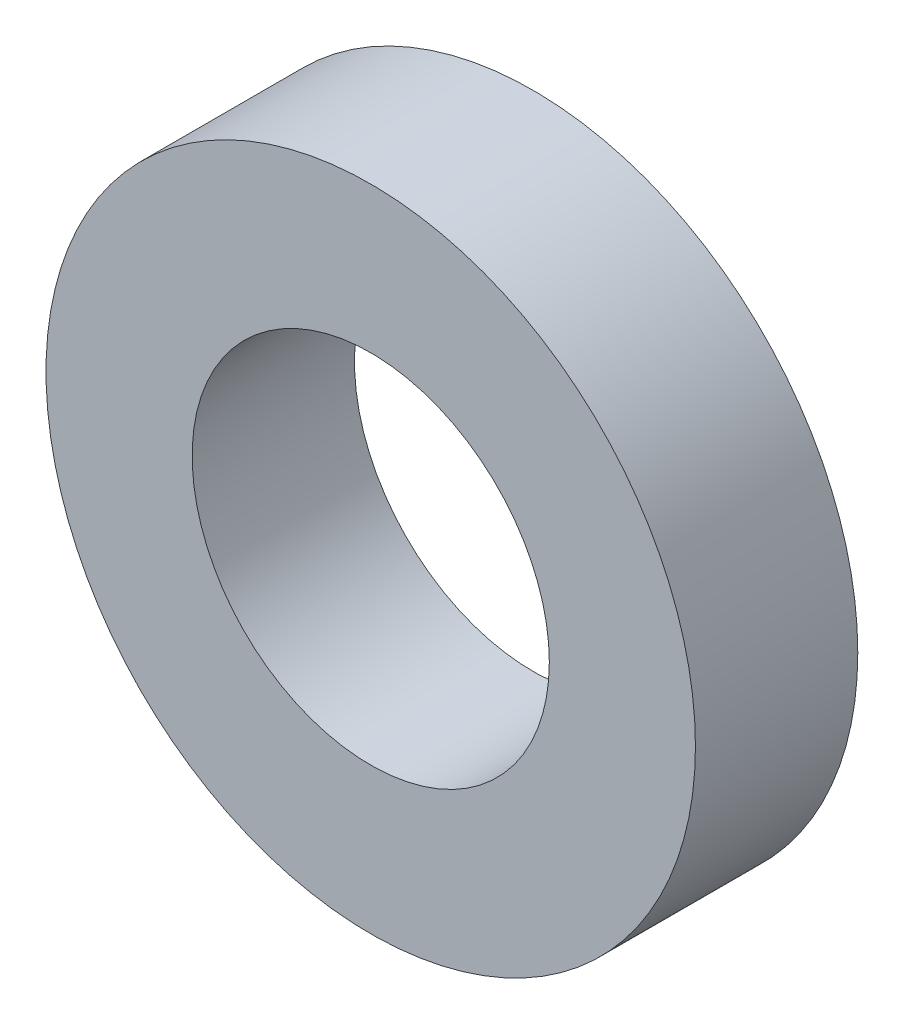
ISO-10303-21;
HEADER;
FILE_DESCRIPTION(('STEP AP214'),'2;1');
FILE_NAME('part.step','',(''),(''),'','','');
FILE_SCHEMA(('AUTOMOTIVE_DESIGN { 1 0 10303 214 1 1 1 1 }'));
ENDSEC;
DATA;
#1=APPLICATION_CONTEXT('core data for automotive mechanical design processes');
#2=APPLICATION_PROTOCOL_DEFINITION('international standard','automotive_design',2000,#1);
#3=PRODUCT_CONTEXT('',#1,'mechanical');
#4=PRODUCT('Part','Part','',(#3));
#5=PRODUCT_RELATED_PRODUCT_CATEGORY('part','',(#4));
#6=PRODUCT_DEFINITION_FORMATION('','',#4);
#7=PRODUCT_DEFINITION_CONTEXT('part definition',#1,'design');
#8=PRODUCT_DEFINITION('design','',#6,#7);
#9=PRODUCT_DEFINITION_SHAPE('','',#8);
#10=(LENGTH_UNIT() NAMED_UNIT(*) SI_UNIT(.MILLI.,.METRE.));
#11=(NAMED_UNIT(*) PLANE_ANGLE_UNIT() SI_UNIT($,.RADIAN.));
#12=(NAMED_UNIT(*) SI_UNIT($,.STERADIAN.) SOLID_ANGLE_UNIT());
#13=UNCERTAINTY_MEASURE_WITH_UNIT(LENGTH_MEASURE(1.E-05),#10,'distance_accuracy_value','');
#14=(GEOMETRIC_REPRESENTATION_CONTEXT(3) GLOBAL_UNCERTAINTY_ASSIGNED_CONTEXT((#13)) GLOBAL_UNIT_ASSIGNED_CONTEXT((#10,
#11,#12)) REPRESENTATION_CONTEXT('',''));
#15=CARTESIAN_POINT('',(0.,0.,0.));
#16=DIRECTION('',(0.,0.,1.));
#17=DIRECTION('',(1.,0.,0.));
#18=AXIS2_PLACEMENT_3D('',#15,#16,#17);
#19=CARTESIAN_POINT('',(0.,0.,1.));
#20=DIRECTION('',(0.,0.,1.));
#21=DIRECTION('',(1.,0.,0.));
#22=AXIS2_PLACEMENT_3D('',#19,#20,#21);
#23=PLANE('',#22);
#24=CARTESIAN_POINT('',(0.,0.,1.));
#25=DIRECTION('',(0.,0.,1.));
#26=DIRECTION('',(1.,0.,0.));
#27=AXIS2_PLACEMENT_3D('',#24,#25,#26);
#28=CIRCLE('',#27,2.);
#29=CARTESIAN_POINT('',(2.,0.,1.));
#30=VERTEX_POINT('',#29);
#31=EDGE_CURVE('E10',#30,#30,#28,.T.);
#32=ORIENTED_EDGE('',*,*,#31,.T.);
#33=EDGE_LOOP('',(#32));
#34=FACE_BOUND('',#33,.T.);
#35=CARTESIAN_POINT('',(0.,0.,1.));
#36=DIRECTION('',(0.,0.,1.));
#37=DIRECTION('',(1.,0.,0.));
#38=AXIS2_PLACEMENT_3D('',#35,#36,#37);
#39=CIRCLE('',#38,1.1);
#40=CARTESIAN_POINT('',(1.1,0.,1.));
#41=VERTEX_POINT('',#40);
#42=EDGE_CURVE('E49',#41,#41,#39,.T.);
#43=ORIENTED_EDGE('',*,*,#42,.F.);
#44=EDGE_LOOP('',(#43));
#45=FACE_BOUND('',#44,.T.);
#46=ADVANCED_FACE('F39',(#34,#45),#23,.T.);
#47=CARTESIAN_POINT('',(0.,0.,0.));
#48=DIRECTION('',(0.,0.,1.));
#49=DIRECTION('',(1.,0.,0.));
#50=AXIS2_PLACEMENT_3D('',#47,#48,#49);
#51=PLANE('',#50);
#52=CARTESIAN_POINT('',(0.,0.,0.));
#53=DIRECTION('',(0.,0.,1.));
#54=DIRECTION('',(1.,0.,0.));
#55=AXIS2_PLACEMENT_3D('',#52,#53,#54);
#56=CIRCLE('',#55,2.);
#57=CARTESIAN_POINT('',(2.,0.,0.));
#58=VERTEX_POINT('',#57);
#59=EDGE_CURVE('E43',#58,#58,#56,.T.);
#60=ORIENTED_EDGE('',*,*,#59,.F.);
#61=EDGE_LOOP('',(#60));
#62=FACE_BOUND('',#61,.T.);
#63=CARTESIAN_POINT('',(0.,0.,0.));
#64=DIRECTION('',(0.,0.,1.));
#65=DIRECTION('',(1.,0.,0.));
#66=AXIS2_PLACEMENT_3D('',#63,#64,#65);
#67=CIRCLE('',#66,1.1);
#68=CARTESIAN_POINT('',(1.1,0.,0.));
#69=VERTEX_POINT('',#68);
#70=EDGE_CURVE('E55',#69,#69,#67,.T.);
#71=ORIENTED_EDGE('',*,*,#70,.T.);
#72=EDGE_LOOP('',(#71));
#73=FACE_BOUND('',#72,.T.);
#74=ADVANCED_FACE('F61',(#62,#73),#51,.F.);
#75=CARTESIAN_POINT('',(0.,0.,1.));
#76=DIRECTION('',(0.,0.,-1.));
#77=DIRECTION('',(-1.,0.,0.));
#78=AXIS2_PLACEMENT_3D('',#75,#76,#77);
#79=CYLINDRICAL_SURFACE('',#78,2.);
#80=ORIENTED_EDGE('',*,*,#31,.F.);
#81=EDGE_LOOP('',(#80));
#82=FACE_BOUND('',#81,.T.);
#83=ORIENTED_EDGE('',*,*,#59,.T.);
#84=EDGE_LOOP('',(#83));
#85=FACE_BOUND('',#84,.T.);
#86=ADVANCED_FACE('F41',(#82,#85),#79,.T.);
#87=CARTESIAN_POINT('',(0.,0.,1.));
#88=DIRECTION('',(0.,0.,-1.));
#89=DIRECTION('',(-1.,0.,0.));
#90=AXIS2_PLACEMENT_3D('',#87,#88,#89);
#91=CYLINDRICAL_SURFACE('',#90,1.1);
#92=ORIENTED_EDGE('',*,*,#42,.T.);
#93=EDGE_LOOP('',(#92));
#94=FACE_BOUND('',#93,.T.);
#95=ORIENTED_EDGE('',*,*,#70,.F.);
#96=EDGE_LOOP('',(#95));
#97=FACE_BOUND('',#96,.T.);
#98=ADVANCED_FACE('F59',(#94,#97),#91,.F.);
#99=CLOSED_SHELL('',(#46,#74,#86,#98));
#100=MANIFOLD_SOLID_BREP('B2',#99);
#101=ADVANCED_BREP_SHAPE_REPRESENTATION('',(#18,#100),#14);
#102=SHAPE_DEFINITION_REPRESENTATION(#9,#101);
ENDSEC;
END-ISO-10303-21;
